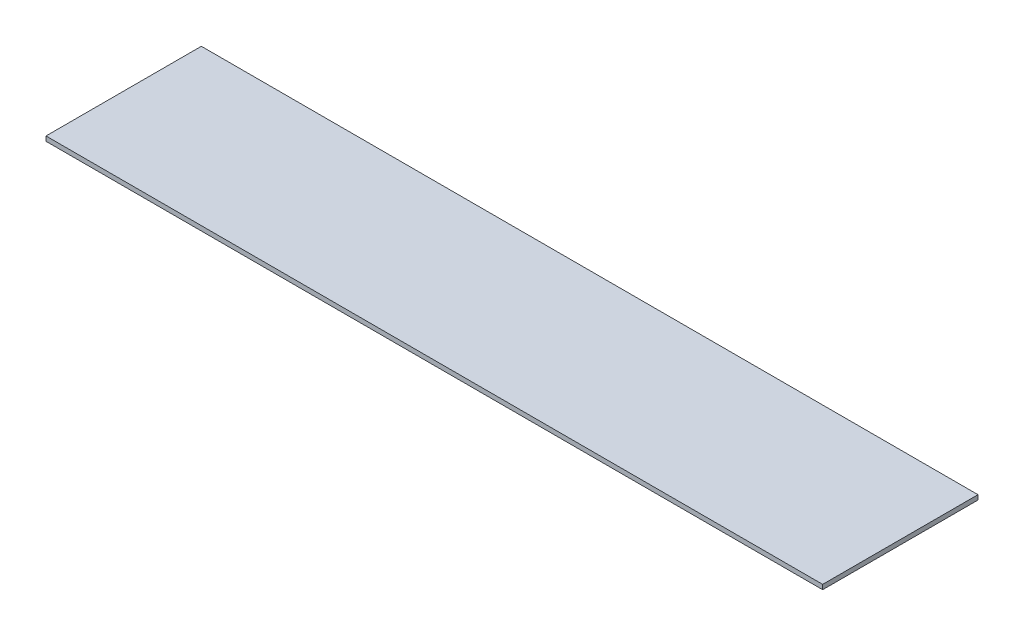
ISO-10303-21;
HEADER;
FILE_DESCRIPTION(('STEP AP214'),'2;1');
FILE_NAME('part.step','',(''),(''),'','','');
FILE_SCHEMA(('AUTOMOTIVE_DESIGN { 1 0 10303 214 1 1 1 1 }'));
ENDSEC;
DATA;
#1=APPLICATION_CONTEXT('core data for automotive mechanical design processes');
#2=APPLICATION_PROTOCOL_DEFINITION('international standard','automotive_design',2000,#1);
#3=PRODUCT_CONTEXT('',#1,'mechanical');
#4=PRODUCT('Part','Part','',(#3));
#5=PRODUCT_RELATED_PRODUCT_CATEGORY('part','',(#4));
#6=PRODUCT_DEFINITION_FORMATION('','',#4);
#7=PRODUCT_DEFINITION_CONTEXT('part definition',#1,'design');
#8=PRODUCT_DEFINITION('design','',#6,#7);
#9=PRODUCT_DEFINITION_SHAPE('','',#8);
#10=(LENGTH_UNIT() NAMED_UNIT(*) SI_UNIT(.MILLI.,.METRE.));
#11=(NAMED_UNIT(*) PLANE_ANGLE_UNIT() SI_UNIT($,.RADIAN.));
#12=(NAMED_UNIT(*) SI_UNIT($,.STERADIAN.) SOLID_ANGLE_UNIT());
#13=UNCERTAINTY_MEASURE_WITH_UNIT(LENGTH_MEASURE(1.E-05),#10,'distance_accuracy_value','');
#14=(GEOMETRIC_REPRESENTATION_CONTEXT(3) GLOBAL_UNCERTAINTY_ASSIGNED_CONTEXT((#13)) GLOBAL_UNIT_ASSIGNED_CONTEXT((#10,
#11,#12)) REPRESENTATION_CONTEXT('',''));
#15=CARTESIAN_POINT('',(0.,0.,0.));
#16=DIRECTION('',(0.,0.,1.));
#17=DIRECTION('',(1.,0.,0.));
#18=AXIS2_PLACEMENT_3D('',#15,#16,#17);
#19=CARTESIAN_POINT('',(0.,0.75,0.));
#20=DIRECTION('',(-1.,0.,0.));
#21=DIRECTION('',(0.,0.,1.));
#22=AXIS2_PLACEMENT_3D('',#19,#20,#21);
#23=PLANE('',#22);
#24=DIRECTION('',(0.,0.,-1.));
#25=VECTOR('',#24,1.);
#26=CARTESIAN_POINT('',(0.,0.,0.));
#27=LINE('',#26,#25);
#28=CARTESIAN_POINT('',(0.,0.,0.));
#29=VERTEX_POINT('',#28);
#30=CARTESIAN_POINT('',(0.,0.,-25.));
#31=VERTEX_POINT('',#30);
#32=EDGE_CURVE('E99',#29,#31,#27,.T.);
#33=ORIENTED_EDGE('',*,*,#32,.T.);
#34=DIRECTION('',(0.,-1.,0.));
#35=VECTOR('',#34,1.);
#36=CARTESIAN_POINT('',(0.,0.75,-25.));
#37=LINE('',#36,#35);
#38=CARTESIAN_POINT('',(0.,0.75,-25.));
#39=VERTEX_POINT('',#38);
#40=EDGE_CURVE('E11',#39,#31,#37,.T.);
#41=ORIENTED_EDGE('',*,*,#40,.F.);
#42=DIRECTION('',(0.,0.,-1.));
#43=VECTOR('',#42,1.);
#44=CARTESIAN_POINT('',(0.,0.75,0.));
#45=LINE('',#44,#43);
#46=CARTESIAN_POINT('',(0.,0.75,0.));
#47=VERTEX_POINT('',#46);
#48=EDGE_CURVE('E87',#47,#39,#45,.T.);
#49=ORIENTED_EDGE('',*,*,#48,.F.);
#50=DIRECTION('',(0.,-1.,0.));
#51=VECTOR('',#50,1.);
#52=CARTESIAN_POINT('',(0.,0.75,0.));
#53=LINE('',#52,#51);
#54=EDGE_CURVE('E95',#47,#29,#53,.T.);
#55=ORIENTED_EDGE('',*,*,#54,.T.);
#56=EDGE_LOOP('',(#33,#41,#49,#55));
#57=FACE_BOUND('',#56,.T.);
#58=ADVANCED_FACE('F36',(#57),#23,.F.);
#59=CARTESIAN_POINT('',(0.,0.75,-25.));
#60=DIRECTION('',(0.,0.,1.));
#61=DIRECTION('',(1.,0.,0.));
#62=AXIS2_PLACEMENT_3D('',#59,#60,#61);
#63=PLANE('',#62);
#64=DIRECTION('',(-1.,0.,0.));
#65=VECTOR('',#64,1.);
#66=CARTESIAN_POINT('',(0.,0.,-25.));
#67=LINE('',#66,#65);
#68=CARTESIAN_POINT('',(-125.,0.,-25.));
#69=VERTEX_POINT('',#68);
#70=EDGE_CURVE('E91',#31,#69,#67,.T.);
#71=ORIENTED_EDGE('',*,*,#70,.T.);
#72=DIRECTION('',(0.,-1.,0.));
#73=VECTOR('',#72,1.);
#74=CARTESIAN_POINT('',(-125.,0.75,-25.));
#75=LINE('',#74,#73);
#76=CARTESIAN_POINT('',(-125.,0.75,-25.));
#77=VERTEX_POINT('',#76);
#78=EDGE_CURVE('E44',#77,#69,#75,.T.);
#79=ORIENTED_EDGE('',*,*,#78,.F.);
#80=DIRECTION('',(-1.,0.,0.));
#81=VECTOR('',#80,1.);
#82=CARTESIAN_POINT('',(0.,0.75,-25.));
#83=LINE('',#82,#81);
#84=EDGE_CURVE('E82',#39,#77,#83,.T.);
#85=ORIENTED_EDGE('',*,*,#84,.F.);
#86=ORIENTED_EDGE('',*,*,#40,.T.);
#87=EDGE_LOOP('',(#71,#79,#85,#86));
#88=FACE_BOUND('',#87,.T.);
#89=ADVANCED_FACE('F90',(#88),#63,.F.);
#90=CARTESIAN_POINT('',(-125.,0.75,0.));
#91=DIRECTION('',(1.,0.,0.));
#92=DIRECTION('',(0.,0.,-1.));
#93=AXIS2_PLACEMENT_3D('',#90,#91,#92);
#94=PLANE('',#93);
#95=DIRECTION('',(0.,0.,1.));
#96=VECTOR('',#95,1.);
#97=CARTESIAN_POINT('',(-125.,0.,0.));
#98=LINE('',#97,#96);
#99=CARTESIAN_POINT('',(-125.,0.,0.));
#100=VERTEX_POINT('',#99);
#101=EDGE_CURVE('E69',#69,#100,#98,.T.);
#102=ORIENTED_EDGE('',*,*,#101,.T.);
#103=DIRECTION('',(0.,-1.,0.));
#104=VECTOR('',#103,1.);
#105=CARTESIAN_POINT('',(-125.,0.75,0.));
#106=LINE('',#105,#104);
#107=CARTESIAN_POINT('',(-125.,0.75,0.));
#108=VERTEX_POINT('',#107);
#109=EDGE_CURVE('E92',#108,#100,#106,.T.);
#110=ORIENTED_EDGE('',*,*,#109,.F.);
#111=DIRECTION('',(0.,0.,1.));
#112=VECTOR('',#111,1.);
#113=CARTESIAN_POINT('',(-125.,0.75,0.));
#114=LINE('',#113,#112);
#115=EDGE_CURVE('E85',#77,#108,#114,.T.);
#116=ORIENTED_EDGE('',*,*,#115,.F.);
#117=ORIENTED_EDGE('',*,*,#78,.T.);
#118=EDGE_LOOP('',(#102,#110,#116,#117));
#119=FACE_BOUND('',#118,.T.);
#120=ADVANCED_FACE('F93',(#119),#94,.F.);
#121=CARTESIAN_POINT('',(0.,0.75,0.));
#122=DIRECTION('',(0.,0.,-1.));
#123=DIRECTION('',(-1.,0.,0.));
#124=AXIS2_PLACEMENT_3D('',#121,#122,#123);
#125=PLANE('',#124);
#126=DIRECTION('',(1.,0.,0.));
#127=VECTOR('',#126,1.);
#128=CARTESIAN_POINT('',(0.,0.,0.));
#129=LINE('',#128,#127);
#130=EDGE_CURVE('E75',#100,#29,#129,.T.);
#131=ORIENTED_EDGE('',*,*,#130,.T.);
#132=ORIENTED_EDGE('',*,*,#54,.F.);
#133=DIRECTION('',(1.,0.,0.));
#134=VECTOR('',#133,1.);
#135=CARTESIAN_POINT('',(0.,0.75,0.));
#136=LINE('',#135,#134);
#137=EDGE_CURVE('E52',#108,#47,#136,.T.);
#138=ORIENTED_EDGE('',*,*,#137,.F.);
#139=ORIENTED_EDGE('',*,*,#109,.T.);
#140=EDGE_LOOP('',(#131,#132,#138,#139));
#141=FACE_BOUND('',#140,.T.);
#142=ADVANCED_FACE('F106',(#141),#125,.F.);
#143=CARTESIAN_POINT('',(0.,0.75,0.));
#144=DIRECTION('',(0.,1.,0.));
#145=DIRECTION('',(0.,0.,1.));
#146=AXIS2_PLACEMENT_3D('',#143,#144,#145);
#147=PLANE('',#146);
#148=ORIENTED_EDGE('',*,*,#48,.T.);
#149=ORIENTED_EDGE('',*,*,#84,.T.);
#150=ORIENTED_EDGE('',*,*,#115,.T.);
#151=ORIENTED_EDGE('',*,*,#137,.T.);
#152=EDGE_LOOP('',(#148,#149,#150,#151));
#153=FACE_BOUND('',#152,.T.);
#154=ADVANCED_FACE('F83',(#153),#147,.T.);
#155=CARTESIAN_POINT('',(0.,0.,0.));
#156=DIRECTION('',(0.,1.,0.));
#157=DIRECTION('',(0.,0.,1.));
#158=AXIS2_PLACEMENT_3D('',#155,#156,#157);
#159=PLANE('',#158);
#160=ORIENTED_EDGE('',*,*,#32,.F.);
#161=ORIENTED_EDGE('',*,*,#130,.F.);
#162=ORIENTED_EDGE('',*,*,#101,.F.);
#163=ORIENTED_EDGE('',*,*,#70,.F.);
#164=EDGE_LOOP('',(#160,#161,#162,#163));
#165=FACE_BOUND('',#164,.T.);
#166=ADVANCED_FACE('F109',(#165),#159,.F.);
#167=CLOSED_SHELL('',(#58,#89,#120,#142,#154,#166));
#168=MANIFOLD_SOLID_BREP('B2',#167);
#169=ADVANCED_BREP_SHAPE_REPRESENTATION('',(#18,#168),#14);
#170=SHAPE_DEFINITION_REPRESENTATION(#9,#169);
ENDSEC;
END-ISO-10303-21;
